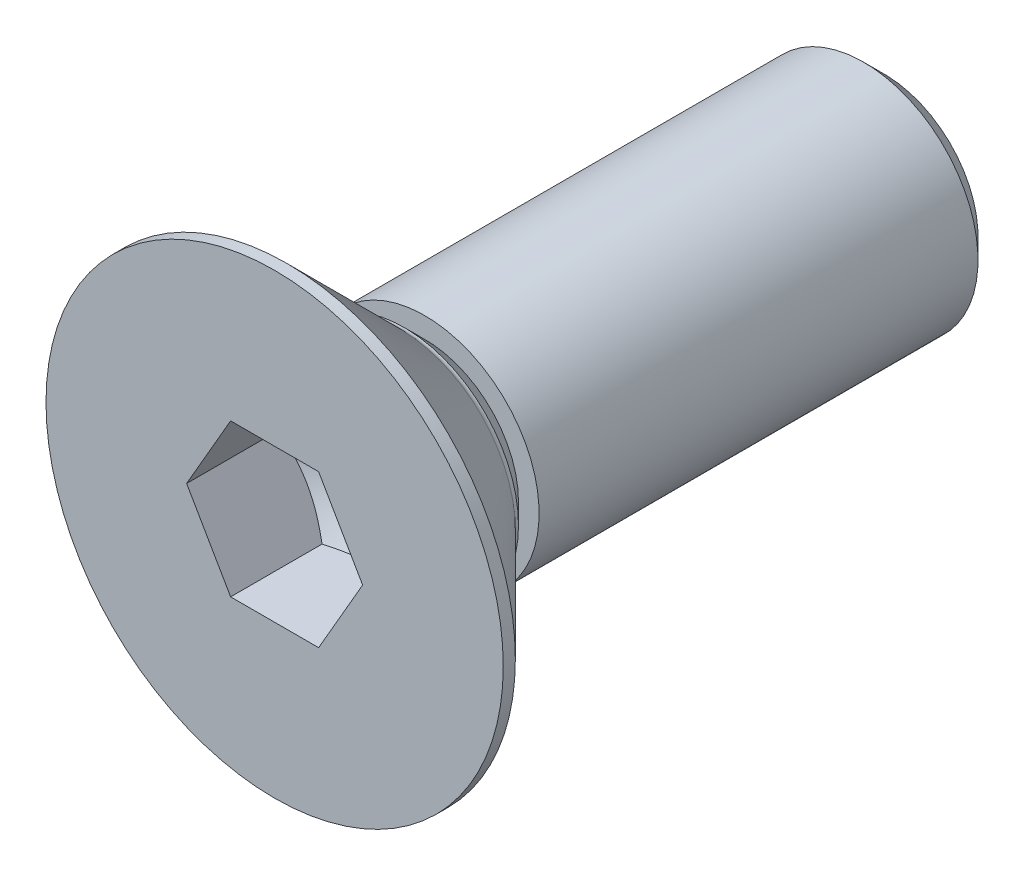
ISO-10303-21;
HEADER;
FILE_DESCRIPTION(('STEP AP214'),'2;1');
FILE_NAME('part.step','',(''),(''),'','','');
FILE_SCHEMA(('AUTOMOTIVE_DESIGN { 1 0 10303 214 1 1 1 1 }'));
ENDSEC;
DATA;
#1=APPLICATION_CONTEXT('core data for automotive mechanical design processes');
#2=APPLICATION_PROTOCOL_DEFINITION('international standard','automotive_design',2000,#1);
#3=PRODUCT_CONTEXT('',#1,'mechanical');
#4=PRODUCT('Part','Part','',(#3));
#5=PRODUCT_RELATED_PRODUCT_CATEGORY('part','',(#4));
#6=PRODUCT_DEFINITION_FORMATION('','',#4);
#7=PRODUCT_DEFINITION_CONTEXT('part definition',#1,'design');
#8=PRODUCT_DEFINITION('design','',#6,#7);
#9=PRODUCT_DEFINITION_SHAPE('','',#8);
#10=(LENGTH_UNIT() NAMED_UNIT(*) SI_UNIT(.MILLI.,.METRE.));
#11=(NAMED_UNIT(*) PLANE_ANGLE_UNIT() SI_UNIT($,.RADIAN.));
#12=(NAMED_UNIT(*) SI_UNIT($,.STERADIAN.) SOLID_ANGLE_UNIT());
#13=UNCERTAINTY_MEASURE_WITH_UNIT(LENGTH_MEASURE(1.E-05),#10,'distance_accuracy_value','');
#14=(GEOMETRIC_REPRESENTATION_CONTEXT(3) GLOBAL_UNCERTAINTY_ASSIGNED_CONTEXT((#13)) GLOBAL_UNIT_ASSIGNED_CONTEXT((#10,
#11,#12)) REPRESENTATION_CONTEXT('',''));
#15=CARTESIAN_POINT('',(0.,0.,0.));
#16=DIRECTION('',(0.,0.,1.));
#17=DIRECTION('',(1.,0.,0.));
#18=AXIS2_PLACEMENT_3D('',#15,#16,#17);
#19=CARTESIAN_POINT('',(0.,3.,0.));
#20=DIRECTION('',(0.,0.,-1.));
#21=DIRECTION('',(-1.,0.,0.));
#22=AXIS2_PLACEMENT_3D('',#19,#20,#21);
#23=PLANE('',#22);
#24=CARTESIAN_POINT('',(0.,0.,0.));
#25=DIRECTION('',(0.,0.,1.));
#26=DIRECTION('',(1.,0.,0.));
#27=AXIS2_PLACEMENT_3D('',#24,#25,#26);
#28=CIRCLE('',#27,3.);
#29=CARTESIAN_POINT('',(3.,0.,0.));
#30=VERTEX_POINT('',#29);
#31=EDGE_CURVE('E161',#30,#30,#28,.T.);
#32=ORIENTED_EDGE('',*,*,#31,.T.);
#33=EDGE_LOOP('',(#32));
#34=FACE_BOUND('',#33,.T.);
#35=DIRECTION('',(-0.5,0.866025403784438,0.));
#36=VECTOR('',#35,1.);
#37=CARTESIAN_POINT('',(-0.43301310567666,2.74999976687495,0.));
#38=LINE('',#37,#36);
#39=CARTESIAN_POINT('',(1.1547,0.,0.));
#40=VERTEX_POINT('',#39);
#41=CARTESIAN_POINT('',(0.57735,0.999999533749892,0.));
#42=VERTEX_POINT('',#41);
#43=EDGE_CURVE('E122',#40,#42,#38,.T.);
#44=ORIENTED_EDGE('',*,*,#43,.F.);
#45=DIRECTION('',(0.5,0.866025403784439,0.));
#46=VECTOR('',#45,1.);
#47=CARTESIAN_POINT('',(2.16506310567666,1.75000023312505,0.));
#48=LINE('',#47,#46);
#49=CARTESIAN_POINT('',(0.57735,-0.999999533749891,0.));
#50=VERTEX_POINT('',#49);
#51=EDGE_CURVE('E69',#50,#40,#48,.T.);
#52=ORIENTED_EDGE('',*,*,#51,.F.);
#53=DIRECTION('',(1.,0.,0.));
#54=VECTOR('',#53,1.);
#55=CARTESIAN_POINT('',(0.,-0.999999533749891,0.));
#56=LINE('',#55,#54);
#57=CARTESIAN_POINT('',(-0.57735,-0.999999533749892,0.));
#58=VERTEX_POINT('',#57);
#59=EDGE_CURVE('E247',#58,#50,#56,.T.);
#60=ORIENTED_EDGE('',*,*,#59,.F.);
#61=DIRECTION('',(0.5,-0.866025403784439,0.));
#62=VECTOR('',#61,1.);
#63=CARTESIAN_POINT('',(-2.16506310567666,1.75000023312505,0.));
#64=LINE('',#63,#62);
#65=CARTESIAN_POINT('',(-1.1547,0.,0.));
#66=VERTEX_POINT('',#65);
#67=EDGE_CURVE('E252',#66,#58,#64,.T.);
#68=ORIENTED_EDGE('',*,*,#67,.F.);
#69=DIRECTION('',(-0.5,-0.866025403784439,0.));
#70=VECTOR('',#69,1.);
#71=CARTESIAN_POINT('',(0.433013105676658,2.74999976687495,0.));
#72=LINE('',#71,#70);
#73=CARTESIAN_POINT('',(-0.57735,0.999999533749891,0.));
#74=VERTEX_POINT('',#73);
#75=EDGE_CURVE('E255',#74,#66,#72,.T.);
#76=ORIENTED_EDGE('',*,*,#75,.F.);
#77=DIRECTION('',(-1.,0.,0.));
#78=VECTOR('',#77,1.);
#79=CARTESIAN_POINT('',(0.,0.999999533749892,0.));
#80=LINE('',#79,#78);
#81=EDGE_CURVE('E239',#42,#74,#80,.T.);
#82=ORIENTED_EDGE('',*,*,#81,.F.);
#83=EDGE_LOOP('',(#44,#52,#60,#68,#76,#82));
#84=FACE_BOUND('',#83,.T.);
#85=ADVANCED_FACE('F46',(#34,#84),#23,.F.);
#86=CARTESIAN_POINT('',(0.,0.,-1.7));
#87=DIRECTION('',(0.,0.,1.));
#88=DIRECTION('',(1.,0.,0.));
#89=AXIS2_PLACEMENT_3D('',#86,#87,#88);
#90=TOROIDAL_SURFACE('',#89,1.6,0.1);
#91=CARTESIAN_POINT('',(0.,0.,-1.7));
#92=DIRECTION('',(0.,0.,1.));
#93=DIRECTION('',(1.,0.,0.));
#94=AXIS2_PLACEMENT_3D('',#91,#92,#93);
#95=CIRCLE('',#94,1.5);
#96=CARTESIAN_POINT('',(1.5,0.,-1.7));
#97=VERTEX_POINT('',#96);
#98=EDGE_CURVE('E187',#97,#97,#95,.T.);
#99=ORIENTED_EDGE('',*,*,#98,.T.);
#100=EDGE_LOOP('',(#99));
#101=FACE_BOUND('',#100,.T.);
#102=CARTESIAN_POINT('',(0.,0.,-1.62928932188134));
#103=DIRECTION('',(0.,0.,1.));
#104=DIRECTION('',(1.,0.,0.));
#105=AXIS2_PLACEMENT_3D('',#102,#103,#104);
#106=CIRCLE('',#105,1.52928932188135);
#107=CARTESIAN_POINT('',(1.52928932188135,0.,-1.62928932188134));
#108=VERTEX_POINT('',#107);
#109=EDGE_CURVE('E260',#108,#108,#106,.T.);
#110=ORIENTED_EDGE('',*,*,#109,.F.);
#111=EDGE_LOOP('',(#110));
#112=FACE_BOUND('',#111,.T.);
#113=ADVANCED_FACE('F225',(#101,#112),#90,.F.);
#114=CARTESIAN_POINT('',(0.,0.,-1.62928932188134));
#115=DIRECTION('',(0.,0.,1.));
#116=DIRECTION('',(1.,0.,0.));
#117=AXIS2_PLACEMENT_3D('',#114,#115,#116);
#118=CONICAL_SURFACE('',#117,1.52928932188135,0.785398163397448);
#119=CARTESIAN_POINT('',(0.,0.,-0.15857864376269));
#120=DIRECTION('',(0.,0.,1.));
#121=DIRECTION('',(1.,0.,0.));
#122=AXIS2_PLACEMENT_3D('',#119,#120,#121);
#123=CIRCLE('',#122,3.);
#124=CARTESIAN_POINT('',(3.,0.,-0.15857864376269));
#125=VERTEX_POINT('',#124);
#126=EDGE_CURVE('E264',#125,#125,#123,.T.);
#127=ORIENTED_EDGE('',*,*,#126,.F.);
#128=EDGE_LOOP('',(#127));
#129=FACE_BOUND('',#128,.T.);
#130=ORIENTED_EDGE('',*,*,#109,.T.);
#131=EDGE_LOOP('',(#130));
#132=FACE_BOUND('',#131,.T.);
#133=ADVANCED_FACE('F221',(#129,#132),#118,.T.);
#134=CARTESIAN_POINT('',(0.,0.,0.));
#135=DIRECTION('',(0.,0.,1.));
#136=DIRECTION('',(1.,0.,0.));
#137=AXIS2_PLACEMENT_3D('',#134,#135,#136);
#138=CYLINDRICAL_SURFACE('',#137,3.);
#139=ORIENTED_EDGE('',*,*,#31,.F.);
#140=EDGE_LOOP('',(#139));
#141=FACE_BOUND('',#140,.T.);
#142=ORIENTED_EDGE('',*,*,#126,.T.);
#143=EDGE_LOOP('',(#142));
#144=FACE_BOUND('',#143,.T.);
#145=ADVANCED_FACE('F218',(#141,#144),#138,.T.);
#146=CARTESIAN_POINT('',(0.57735,0.999999533749892,-2.86666635583326));
#147=DIRECTION('',(-0.866025403784438,-0.5,0.));
#148=DIRECTION('',(-0.5,0.866025403784438,0.));
#149=AXIS2_PLACEMENT_3D('',#146,#147,#148);
#150=PLANE('',#149);
#151=ORIENTED_EDGE('',*,*,#43,.T.);
#152=DIRECTION('',(0.,0.,1.));
#153=VECTOR('',#152,1.);
#154=CARTESIAN_POINT('',(0.57735,0.999999533749892,-2.86666635583326));
#155=LINE('',#154,#153);
#156=CARTESIAN_POINT('',(0.57735,0.999999533749892,-1.2));
#157=VERTEX_POINT('',#156);
#158=EDGE_CURVE('E61',#157,#42,#155,.T.);
#159=ORIENTED_EDGE('',*,*,#158,.F.);
#160=CARTESIAN_POINT('',(1.15470115470054,-1.9999999999573E-06,-1.19999933333233));
#161=CARTESIAN_POINT('',(1.12933009927234,0.0439419570432813,-1.21465160869452));
#162=CARTESIAN_POINT('',(1.10374004129754,0.0882652376242722,-1.22797709465646));
#163=CARTESIAN_POINT('',(1.05211684902319,0.17767922949234,-1.25123634937556));
#164=CARTESIAN_POINT('',(1.02608279776624,0.22277152899623,-1.26116189075497));
#165=CARTESIAN_POINT('',(0.974337322784001,0.312397320727257,-1.27661173775717));
#166=CARTESIAN_POINT('',(0.948633858612371,0.356917026603046,-1.28223888221856));
#167=CARTESIAN_POINT('',(0.897106047785879,0.446165812957328,-1.28895530751385));
#168=CARTESIAN_POINT('',(0.871281888296732,0.490894569255293,-1.29005015141485));
#169=CARTESIAN_POINT('',(0.823032064442526,0.574465715627026,-1.28776689498848));
#170=CARTESIAN_POINT('',(0.800599160429648,0.613320645138646,-1.2849494098561));
#171=CARTESIAN_POINT('',(0.755879495715112,0.690777376521668,-1.27602137620272));
#172=CARTESIAN_POINT('',(0.733592889575674,0.729378910683451,-1.26990778075883));
#173=CARTESIAN_POINT('',(0.688781095362013,0.806995215039832,-1.25462494978085));
#174=CARTESIAN_POINT('',(0.666261576071427,0.846000166613155,-1.2453909604397));
#175=CARTESIAN_POINT('',(0.621558322302024,0.923428473405406,-1.2244336985923));
#176=CARTESIAN_POINT('',(0.599374015548132,0.961852819833839,-1.21271534716617));
#177=CARTESIAN_POINT('',(0.577348845299461,1.00000153374989,-1.19999933333233));
#178=B_SPLINE_CURVE_WITH_KNOTS('',3,(#160,#161,#162,#163,#164,#165,#166,#167,#168,#169,#170,
#171,#172,#173,#174,#175,#176,#177),.UNSPECIFIED.,.F.,.F.,(4,2,2,2,2,2,2,2,4),(0.,
0.158508089994533,0.317397081098293,0.47235404642363,0.627120756921707,0.76185516297255,
0.896714331530991,1.0345640617321,1.17214324556804),.UNSPECIFIED.);
#179=CARTESIAN_POINT('',(1.1547,0.,-1.2));
#180=VERTEX_POINT('',#179);
#181=EDGE_CURVE('E111',#180,#157,#178,.T.);
#182=ORIENTED_EDGE('',*,*,#181,.F.);
#183=DIRECTION('',(0.,0.,1.));
#184=VECTOR('',#183,1.);
#185=CARTESIAN_POINT('',(1.1547,0.,-2.86666635583326));
#186=LINE('',#185,#184);
#187=EDGE_CURVE('E151',#180,#40,#186,.T.);
#188=ORIENTED_EDGE('',*,*,#187,.T.);
#189=EDGE_LOOP('',(#151,#159,#182,#188));
#190=FACE_BOUND('',#189,.T.);
#191=ADVANCED_FACE('F120',(#190),#150,.T.);
#192=CARTESIAN_POINT('',(1.1547,0.,-2.86666635583326));
#193=DIRECTION('',(-0.866025403784439,0.5,0.));
#194=DIRECTION('',(0.5,0.866025403784439,0.));
#195=AXIS2_PLACEMENT_3D('',#192,#193,#194);
#196=PLANE('',#195);
#197=ORIENTED_EDGE('',*,*,#51,.T.);
#198=ORIENTED_EDGE('',*,*,#187,.F.);
#199=CARTESIAN_POINT('',(0.577348845299462,-1.00000153374989,-1.19999933333233));
#200=CARTESIAN_POINT('',(0.602719900727658,-0.956057576706609,-1.21465160869452));
#201=CARTESIAN_POINT('',(0.628309958702461,-0.911734296125618,-1.22797709465646));
#202=CARTESIAN_POINT('',(0.679933150976809,-0.82232030425755,-1.25123634937556));
#203=CARTESIAN_POINT('',(0.705967202233759,-0.77722800475366,-1.26116189075497));
#204=CARTESIAN_POINT('',(0.757712677216,-0.687602213022634,-1.27661173775717));
#205=CARTESIAN_POINT('',(0.78341614138763,-0.643082507146845,-1.28223888221856));
#206=CARTESIAN_POINT('',(0.834943952214122,-0.553833720792562,-1.28895530751385));
#207=CARTESIAN_POINT('',(0.860768111703269,-0.509104964494598,-1.29005015141485));
#208=CARTESIAN_POINT('',(0.909017935557475,-0.425533818122865,-1.28776689498848));
#209=CARTESIAN_POINT('',(0.931450839570352,-0.386678888611245,-1.2849494098561));
#210=CARTESIAN_POINT('',(0.976170504284888,-0.309222157228223,-1.27602137620272));
#211=CARTESIAN_POINT('',(0.998457110424327,-0.27062062306644,-1.26990778075883));
#212=CARTESIAN_POINT('',(1.04326890463799,-0.193004318710059,-1.25462494978085));
#213=CARTESIAN_POINT('',(1.06578842392857,-0.153999367136736,-1.2453909604397));
#214=CARTESIAN_POINT('',(1.11049167769798,-0.0765710603444854,-1.2244336985923));
#215=CARTESIAN_POINT('',(1.13267598445187,-0.0381467139160524,-1.21271534716617));
#216=CARTESIAN_POINT('',(1.15470115470054,1.99999999991757E-06,-1.19999933333233));
#217=B_SPLINE_CURVE_WITH_KNOTS('',3,(#199,#200,#201,#202,#203,#204,#205,#206,#207,#208,#209,
#210,#211,#212,#213,#214,#215,#216),.UNSPECIFIED.,.F.,.F.,(4,2,2,2,2,2,2,2,4),(0.,
0.158508089994532,0.317397081098292,0.472354046423629,0.627120756921705,0.761855162972549,
0.89671433153099,1.0345640617321,1.17214324556804),.UNSPECIFIED.);
#218=CARTESIAN_POINT('',(0.57735,-0.999999533749891,-1.2));
#219=VERTEX_POINT('',#218);
#220=EDGE_CURVE('E116',#219,#180,#217,.T.);
#221=ORIENTED_EDGE('',*,*,#220,.F.);
#222=DIRECTION('',(0.,0.,1.));
#223=VECTOR('',#222,1.);
#224=CARTESIAN_POINT('',(0.57735,-0.999999533749891,-2.86666635583326));
#225=LINE('',#224,#223);
#226=EDGE_CURVE('E148',#219,#50,#225,.T.);
#227=ORIENTED_EDGE('',*,*,#226,.T.);
#228=EDGE_LOOP('',(#197,#198,#221,#227));
#229=FACE_BOUND('',#228,.T.);
#230=ADVANCED_FACE('F211',(#229),#196,.T.);
#231=CARTESIAN_POINT('',(0.57735,-0.999999533749891,-2.86666635583326));
#232=DIRECTION('',(0.,1.,0.));
#233=DIRECTION('',(1.,0.,0.));
#234=AXIS2_PLACEMENT_3D('',#231,#232,#233);
#235=PLANE('',#234);
#236=ORIENTED_EDGE('',*,*,#59,.T.);
#237=ORIENTED_EDGE('',*,*,#226,.F.);
#238=CARTESIAN_POINT('',(-1.49514442485991,-0.999999533749892,-0.828164884370704));
#239=CARTESIAN_POINT('',(-1.45196058536606,-0.999999533749892,-0.848885142345374));
#240=CARTESIAN_POINT('',(-1.40867216909359,-0.999999533749891,-0.869386480926814));
#241=CARTESIAN_POINT('',(-1.32182886600433,-0.999999533749891,-0.909836700302959));
#242=CARTESIAN_POINT('',(-1.2782739329316,-0.999999533749891,-0.929785481674132));
#243=CARTESIAN_POINT('',(-1.14662287013031,-0.999999533749891,-0.988854941047534));
#244=CARTESIAN_POINT('',(-1.05805675536899,-0.999999533749892,-1.02694755109633));
#245=CARTESIAN_POINT('',(-0.876832601569534,-0.999999533749891,-1.0997542233085));
#246=CARTESIAN_POINT('',(-0.784128092285833,-0.999999533749891,-1.13435418810903));
#247=CARTESIAN_POINT('',(-0.596331471486308,-0.999999533749891,-1.19592652723152));
#248=CARTESIAN_POINT('',(-0.501246273385447,-0.999999533749892,-1.2229187041279));
#249=CARTESIAN_POINT('',(-0.356699820153757,-0.999999533749892,-1.25422420468152));
#250=CARTESIAN_POINT('',(-0.308244019411516,-0.999999533749891,-1.26312487202941));
#251=CARTESIAN_POINT('',(-0.210788772252077,-0.999999533749891,-1.27725753224299));
#252=CARTESIAN_POINT('',(-0.161789362800288,-0.999999533749891,-1.28248977302728));
#253=CARTESIAN_POINT('',(-0.0641060187969571,-0.999999533749891,-1.28880097762652));
#254=CARTESIAN_POINT('',(-0.0154253386130911,-0.999999533749891,-1.28992895306237));
#255=CARTESIAN_POINT('',(0.081855318550815,-0.999999533749891,-1.28806698061856));
#256=CARTESIAN_POINT('',(0.130455290347174,-0.999999533749891,-1.28507677775785));
#257=CARTESIAN_POINT('',(0.250369475163949,-0.999999533749891,-1.27288164404504));
#258=CARTESIAN_POINT('',(0.321451773511317,-0.999999533749891,-1.26139140968933));
#259=CARTESIAN_POINT('',(0.462228831139483,-0.999999533749891,-1.23175966587677));
#260=CARTESIAN_POINT('',(0.531921810918688,-0.999999533749891,-1.2136101400332));
#261=CARTESIAN_POINT('',(0.671415426701006,-0.999999533749891,-1.17213028702696));
#262=CARTESIAN_POINT('',(0.74118339183766,-0.999999533749891,-1.14869285275451));
#263=CARTESIAN_POINT('',(0.879437913589634,-0.999999533749891,-1.09843555752384));
#264=CARTESIAN_POINT('',(0.947924910374636,-0.999999533749891,-1.07161688390175));
#265=CARTESIAN_POINT('',(1.12214344819038,-0.999999533749891,-0.999946665973691));
#266=CARTESIAN_POINT('',(1.22718281828392,-0.999999533749891,-0.953428848532586));
#267=CARTESIAN_POINT('',(1.43575436261154,-0.999999533749891,-0.857125429903967));
#268=CARTESIAN_POINT('',(1.53928614185372,-0.999999533749891,-0.80733899050407));
#269=CARTESIAN_POINT('',(1.74545816034081,-0.999999533749891,-0.705667813198291));
#270=CARTESIAN_POINT('',(1.84809723800399,-0.999999533749891,-0.653780729163059));
#271=CARTESIAN_POINT('',(2.05268820074271,-0.999999533749891,-0.548667861023064));
#272=CARTESIAN_POINT('',(2.15464006298767,-0.999999533749891,-0.495442032717929));
#273=CARTESIAN_POINT('',(2.34844987211842,-0.999999533749891,-0.393141194911444));
#274=CARTESIAN_POINT('',(2.4403516275912,-0.999999533749891,-0.344149002309723));
#275=CARTESIAN_POINT('',(2.62385949655876,-0.999999533749891,-0.245606629023408));
#276=CARTESIAN_POINT('',(2.71546559895035,-0.999999533749891,-0.196056427689531));
#277=CARTESIAN_POINT('',(2.89821733508573,-0.999999533749891,-0.0966643053291436));
#278=CARTESIAN_POINT('',(2.98936354739568,-0.99999953374989,-0.0468234468561076));
#279=CARTESIAN_POINT('',(3.17147169543988,-0.99999953374989,0.0531826635437778));
#280=CARTESIAN_POINT('',(3.26243364056806,-0.999999533749891,0.103347898358038));
#281=CARTESIAN_POINT('',(3.35332938008973,-0.999999533749891,0.153632054375236));
#282=B_SPLINE_CURVE_WITH_KNOTS('',3,(#238,#239,#240,#241,#242,#243,#244,#245,#246,#247,#248,
#249,#250,#251,#252,#253,#254,#255,#256,#257,#258,#259,#260,#261,#262,#263,#264,#265,#266,#267,
#268,#269,#270,#271,#272,#273,#274,#275,#276,#277,#278,#279,#280,#281),.UNSPECIFIED.,.F.,.F.,(4,
2,2,2,2,2,2,2,2,2,2,2,2,2,2,2,2,2,2,2,2,4),(0.,0.143690272658494,0.287406234227527,
0.576560055393514,0.873259077741899,1.16917852539457,1.31686277501978,1.46453704292645,
1.6104419422712,1.75635587586723,1.9719244208457,2.1877533209983,2.40842488718949,
2.62901917835835,2.97354524236226,3.31816000509865,3.66317088870179,4.0081931782759,
4.32062550425272,4.63306943012528,4.94471865214482,5.25635156499875),.UNSPECIFIED.);
#283=CARTESIAN_POINT('',(-0.57735,-0.999999533749892,-1.2));
#284=VERTEX_POINT('',#283);
#285=EDGE_CURVE('E197',#284,#219,#282,.T.);
#286=ORIENTED_EDGE('',*,*,#285,.F.);
#287=DIRECTION('',(0.,0.,1.));
#288=VECTOR('',#287,1.);
#289=CARTESIAN_POINT('',(-0.57735,-0.999999533749892,-2.86666635583326));
#290=LINE('',#289,#288);
#291=EDGE_CURVE('E144',#284,#58,#290,.T.);
#292=ORIENTED_EDGE('',*,*,#291,.T.);
#293=EDGE_LOOP('',(#236,#237,#286,#292));
#294=FACE_BOUND('',#293,.T.);
#295=ADVANCED_FACE('F208',(#294),#235,.T.);
#296=CARTESIAN_POINT('',(-0.57735,-0.999999533749892,-2.86666635583326));
#297=DIRECTION('',(0.866025403784439,0.5,0.));
#298=DIRECTION('',(0.5,-0.866025403784439,0.));
#299=AXIS2_PLACEMENT_3D('',#296,#297,#298);
#300=PLANE('',#299);
#301=ORIENTED_EDGE('',*,*,#67,.T.);
#302=ORIENTED_EDGE('',*,*,#291,.F.);
#303=CARTESIAN_POINT('',(-1.15470115470054,1.99999999972245E-06,-1.19999933333233));
#304=CARTESIAN_POINT('',(-1.12933009927234,-0.0439419570432819,-1.21465160869452));
#305=CARTESIAN_POINT('',(-1.10374004129754,-0.088265237624273,-1.22797709465646));
#306=CARTESIAN_POINT('',(-1.05211684902319,-0.177679229492341,-1.25123634937556));
#307=CARTESIAN_POINT('',(-1.02608279776624,-0.222771528996231,-1.26116189075497));
#308=CARTESIAN_POINT('',(-0.974337322784,-0.312397320727257,-1.27661173775717));
#309=CARTESIAN_POINT('',(-0.948633858612371,-0.356917026603046,-1.28223888221856));
#310=CARTESIAN_POINT('',(-0.897106047785878,-0.446165812957329,-1.28895530751385));
#311=CARTESIAN_POINT('',(-0.871281888296731,-0.490894569255293,-1.29005015141485));
#312=CARTESIAN_POINT('',(-0.823032064442525,-0.574465715627026,-1.28776689498848));
#313=CARTESIAN_POINT('',(-0.800599160429648,-0.613320645138646,-1.2849494098561));
#314=CARTESIAN_POINT('',(-0.755879495715112,-0.690777376521668,-1.27602137620272));
#315=CARTESIAN_POINT('',(-0.733592889575674,-0.729378910683452,-1.26990778075883));
#316=CARTESIAN_POINT('',(-0.688781095362013,-0.806995215039832,-1.25462494978085));
#317=CARTESIAN_POINT('',(-0.666261576071427,-0.846000166613155,-1.2453909604397));
#318=CARTESIAN_POINT('',(-0.621558322302024,-0.923428473405406,-1.2244336985923));
#319=CARTESIAN_POINT('',(-0.599374015548133,-0.961852819833839,-1.21271534716617));
#320=CARTESIAN_POINT('',(-0.577348845299461,-1.00000153374989,-1.19999933333233));
#321=B_SPLINE_CURVE_WITH_KNOTS('',3,(#303,#304,#305,#306,#307,#308,#309,#310,#311,#312,#313,
#314,#315,#316,#317,#318,#319,#320),.UNSPECIFIED.,.F.,.F.,(4,2,2,2,2,2,2,2,4),(0.,
0.158508089994533,0.317397081098293,0.472354046423629,0.627120756921706,0.76185516297255,
0.89671433153099,1.0345640617321,1.17214324556804),.UNSPECIFIED.);
#322=CARTESIAN_POINT('',(-1.1547,0.,-1.2));
#323=VERTEX_POINT('',#322);
#324=EDGE_CURVE('E186',#323,#284,#321,.T.);
#325=ORIENTED_EDGE('',*,*,#324,.F.);
#326=DIRECTION('',(0.,0.,1.));
#327=VECTOR('',#326,1.);
#328=CARTESIAN_POINT('',(-1.1547,0.,-2.86666635583326));
#329=LINE('',#328,#327);
#330=EDGE_CURVE('E131',#323,#66,#329,.T.);
#331=ORIENTED_EDGE('',*,*,#330,.T.);
#332=EDGE_LOOP('',(#301,#302,#325,#331));
#333=FACE_BOUND('',#332,.T.);
#334=ADVANCED_FACE('F173',(#333),#300,.T.);
#335=CARTESIAN_POINT('',(-1.1547,0.,-2.86666635583326));
#336=DIRECTION('',(0.866025403784439,-0.5,0.));
#337=DIRECTION('',(-0.5,-0.866025403784439,0.));
#338=AXIS2_PLACEMENT_3D('',#335,#336,#337);
#339=PLANE('',#338);
#340=ORIENTED_EDGE('',*,*,#75,.T.);
#341=ORIENTED_EDGE('',*,*,#330,.F.);
#342=CARTESIAN_POINT('',(-0.577348845299462,1.00000153374989,-1.19999933333233));
#343=CARTESIAN_POINT('',(-0.602719900727658,0.956057576706609,-1.21465160869452));
#344=CARTESIAN_POINT('',(-0.628309958702461,0.911734296125618,-1.22797709465646));
#345=CARTESIAN_POINT('',(-0.679933150976809,0.82232030425755,-1.25123634937556));
#346=CARTESIAN_POINT('',(-0.705967202233759,0.77722800475366,-1.26116189075497));
#347=CARTESIAN_POINT('',(-0.757712677216,0.687602213022634,-1.27661173775717));
#348=CARTESIAN_POINT('',(-0.78341614138763,0.643082507146845,-1.28223888221856));
#349=CARTESIAN_POINT('',(-0.834943952214122,0.553833720792562,-1.28895530751385));
#350=CARTESIAN_POINT('',(-0.860768111703269,0.509104964494598,-1.29005015141485));
#351=CARTESIAN_POINT('',(-0.909017935557475,0.425533818122865,-1.28776689498848));
#352=CARTESIAN_POINT('',(-0.931450839570352,0.386678888611245,-1.2849494098561));
#353=CARTESIAN_POINT('',(-0.976170504284889,0.309222157228223,-1.27602137620272));
#354=CARTESIAN_POINT('',(-0.998457110424327,0.27062062306644,-1.26990778075883));
#355=CARTESIAN_POINT('',(-1.04326890463799,0.193004318710059,-1.25462494978085));
#356=CARTESIAN_POINT('',(-1.06578842392857,0.153999367136736,-1.2453909604397));
#357=CARTESIAN_POINT('',(-1.11049167769798,0.0765710603444851,-1.2244336985923));
#358=CARTESIAN_POINT('',(-1.13267598445187,0.0381467139160521,-1.21271534716617));
#359=CARTESIAN_POINT('',(-1.15470115470054,-2.00000000035485E-06,-1.19999933333233));
#360=B_SPLINE_CURVE_WITH_KNOTS('',3,(#342,#343,#344,#345,#346,#347,#348,#349,#350,#351,#352,
#353,#354,#355,#356,#357,#358,#359),.UNSPECIFIED.,.F.,.F.,(4,2,2,2,2,2,2,2,4),(0.,
0.158508089994533,0.317397081098292,0.472354046423628,0.627120756921705,0.761855162972549,
0.89671433153099,1.0345640617321,1.17214324556804),.UNSPECIFIED.);
#361=CARTESIAN_POINT('',(-0.57735,0.999999533749891,-1.2));
#362=VERTEX_POINT('',#361);
#363=EDGE_CURVE('E178',#362,#323,#360,.T.);
#364=ORIENTED_EDGE('',*,*,#363,.F.);
#365=DIRECTION('',(0.,0.,1.));
#366=VECTOR('',#365,1.);
#367=CARTESIAN_POINT('',(-0.57735,0.999999533749891,-2.86666635583326));
#368=LINE('',#367,#366);
#369=EDGE_CURVE('E125',#362,#74,#368,.T.);
#370=ORIENTED_EDGE('',*,*,#369,.T.);
#371=EDGE_LOOP('',(#340,#341,#364,#370));
#372=FACE_BOUND('',#371,.T.);
#373=ADVANCED_FACE('F169',(#372),#339,.T.);
#374=CARTESIAN_POINT('',(-0.57735,0.999999533749891,-2.86666635583326));
#375=DIRECTION('',(0.,-1.,0.));
#376=DIRECTION('',(-1.,0.,0.));
#377=AXIS2_PLACEMENT_3D('',#374,#375,#376);
#378=PLANE('',#377);
#379=ORIENTED_EDGE('',*,*,#81,.T.);
#380=ORIENTED_EDGE('',*,*,#369,.F.);
#381=CARTESIAN_POINT('',(-1.49514442485992,0.999999533749891,-0.828164884370704));
#382=CARTESIAN_POINT('',(-1.45196058536606,0.999999533749891,-0.848885142345374));
#383=CARTESIAN_POINT('',(-1.40867216909359,0.999999533749891,-0.869386480926813));
#384=CARTESIAN_POINT('',(-1.32182886600434,0.999999533749891,-0.909836700302958));
#385=CARTESIAN_POINT('',(-1.2782739329316,0.999999533749891,-0.929785481674132));
#386=CARTESIAN_POINT('',(-1.14662287013032,0.999999533749891,-0.988854941047534));
#387=CARTESIAN_POINT('',(-1.05805675536899,0.999999533749891,-1.02694755109632));
#388=CARTESIAN_POINT('',(-0.876832601569536,0.999999533749891,-1.0997542233085));
#389=CARTESIAN_POINT('',(-0.784128092285834,0.999999533749891,-1.13435418810903));
#390=CARTESIAN_POINT('',(-0.596331471486309,0.999999533749891,-1.19592652723152));
#391=CARTESIAN_POINT('',(-0.501246273385448,0.999999533749891,-1.2229187041279));
#392=CARTESIAN_POINT('',(-0.356699820153758,0.999999533749891,-1.25422420468152));
#393=CARTESIAN_POINT('',(-0.308244019411517,0.999999533749891,-1.26312487202941));
#394=CARTESIAN_POINT('',(-0.210788772252078,0.999999533749891,-1.27725753224299));
#395=CARTESIAN_POINT('',(-0.161789362800289,0.999999533749891,-1.28248977302728));
#396=CARTESIAN_POINT('',(-0.0641060187969578,0.999999533749891,-1.28880097762652));
#397=CARTESIAN_POINT('',(-0.0154253386130918,0.999999533749891,-1.28992895306237));
#398=CARTESIAN_POINT('',(0.0818553185508143,0.999999533749891,-1.28806698061856));
#399=CARTESIAN_POINT('',(0.130455290347173,0.999999533749892,-1.28507677775785));
#400=CARTESIAN_POINT('',(0.250369475163948,0.999999533749892,-1.27288164404504));
#401=CARTESIAN_POINT('',(0.321451773511316,0.999999533749892,-1.26139140968933));
#402=CARTESIAN_POINT('',(0.462228831139481,0.999999533749891,-1.23175966587677));
#403=CARTESIAN_POINT('',(0.531921810918686,0.999999533749892,-1.2136101400332));
#404=CARTESIAN_POINT('',(0.671415426701004,0.999999533749892,-1.17213028702696));
#405=CARTESIAN_POINT('',(0.741183391837658,0.999999533749892,-1.14869285275451));
#406=CARTESIAN_POINT('',(0.879437913589632,0.999999533749892,-1.09843555752384));
#407=CARTESIAN_POINT('',(0.947924910374634,0.999999533749892,-1.07161688390175));
#408=CARTESIAN_POINT('',(1.12214344819038,0.999999533749892,-0.999946665973691));
#409=CARTESIAN_POINT('',(1.22718281828392,0.999999533749892,-0.953428848532586));
#410=CARTESIAN_POINT('',(1.43575436261153,0.999999533749892,-0.857125429903967));
#411=CARTESIAN_POINT('',(1.53928614185372,0.999999533749892,-0.80733899050407));
#412=CARTESIAN_POINT('',(1.74545816034081,0.999999533749892,-0.705667813198291));
#413=CARTESIAN_POINT('',(1.84809723800398,0.999999533749892,-0.65378072916306));
#414=CARTESIAN_POINT('',(2.05268820074271,0.999999533749892,-0.548667861023064));
#415=CARTESIAN_POINT('',(2.15464006298767,0.999999533749892,-0.495442032717929));
#416=CARTESIAN_POINT('',(2.34844987211841,0.999999533749892,-0.393141194911444));
#417=CARTESIAN_POINT('',(2.4403516275912,0.999999533749892,-0.344149002309723));
#418=CARTESIAN_POINT('',(2.62385949655876,0.999999533749892,-0.245606629023408));
#419=CARTESIAN_POINT('',(2.71546559895035,0.999999533749893,-0.196056427689531));
#420=CARTESIAN_POINT('',(2.89821733508573,0.999999533749893,-0.096664305329144));
#421=CARTESIAN_POINT('',(2.98936354739567,0.999999533749893,-0.0468234468561076));
#422=CARTESIAN_POINT('',(3.17147169543988,0.999999533749893,0.0531826635437783));
#423=CARTESIAN_POINT('',(3.26243364056806,0.999999533749893,0.103347898358039));
#424=CARTESIAN_POINT('',(3.35332938008973,0.999999533749893,0.153632054375236));
#425=B_SPLINE_CURVE_WITH_KNOTS('',3,(#381,#382,#383,#384,#385,#386,#387,#388,#389,#390,#391,
#392,#393,#394,#395,#396,#397,#398,#399,#400,#401,#402,#403,#404,#405,#406,#407,#408,#409,#410,
#411,#412,#413,#414,#415,#416,#417,#418,#419,#420,#421,#422,#423,#424),.UNSPECIFIED.,.F.,.F.,(4,
2,2,2,2,2,2,2,2,2,2,2,2,2,2,2,2,2,2,2,2,4),(0.,0.143690272658494,0.287406234227527,
0.576560055393514,0.873259077741899,1.16917852539457,1.31686277501978,1.46453704292645,
1.6104419422712,1.75635587586723,1.9719244208457,2.1877533209983,2.40842488718949,
2.62901917835835,2.97354524236226,3.31816000509865,3.66317088870179,4.0081931782759,
4.32062550425272,4.63306943012528,4.94471865214482,5.25635156499876),.UNSPECIFIED.);
#426=EDGE_CURVE('E113',#157,#362,#425,.F.);
#427=ORIENTED_EDGE('',*,*,#426,.F.);
#428=ORIENTED_EDGE('',*,*,#158,.T.);
#429=EDGE_LOOP('',(#379,#380,#427,#428));
#430=FACE_BOUND('',#429,.T.);
#431=ADVANCED_FACE('F106',(#430),#378,.T.);
#432=CARTESIAN_POINT('',(0.,0.,-1.86666635583326));
#433=DIRECTION('',(0.,0.,1.));
#434=DIRECTION('',(1.,0.,0.));
#435=AXIS2_PLACEMENT_3D('',#432,#433,#434);
#436=CONICAL_SURFACE('',#435,0.,1.0471975511966);
#437=CARTESIAN_POINT('',(0.,0.,-1.86666635583326));
#438=VERTEX_POINT('',#437);
#439=VERTEX_LOOP('',#438);
#440=FACE_BOUND('',#439,.T.);
#441=ORIENTED_EDGE('',*,*,#181,.T.);
#442=ORIENTED_EDGE('',*,*,#426,.T.);
#443=ORIENTED_EDGE('',*,*,#363,.T.);
#444=ORIENTED_EDGE('',*,*,#324,.T.);
#445=ORIENTED_EDGE('',*,*,#285,.T.);
#446=ORIENTED_EDGE('',*,*,#220,.T.);
#447=EDGE_LOOP('',(#441,#442,#443,#444,#445,#446));
#448=FACE_BOUND('',#447,.T.);
#449=ADVANCED_FACE('F102',(#440,#448),#436,.F.);
#450=CARTESIAN_POINT('',(0.,0.,-1.7));
#451=DIRECTION('',(0.,0.,1.));
#452=DIRECTION('',(1.,0.,0.));
#453=AXIS2_PLACEMENT_3D('',#450,#451,#452);
#454=CONICAL_SURFACE('',#453,1.5,0.785398163397448);
#455=CARTESIAN_POINT('',(0.,0.,-1.970625));
#456=DIRECTION('',(0.,0.,1.));
#457=DIRECTION('',(1.,0.,0.));
#458=AXIS2_PLACEMENT_3D('',#455,#456,#457);
#459=CIRCLE('',#458,1.229375);
#460=CARTESIAN_POINT('',(1.229375,0.,-1.970625));
#461=VERTEX_POINT('',#460);
#462=EDGE_CURVE('E414',#461,#461,#459,.F.);
#463=ORIENTED_EDGE('',*,*,#462,.F.);
#464=EDGE_LOOP('',(#463));
#465=FACE_BOUND('',#464,.T.);
#466=ORIENTED_EDGE('',*,*,#98,.F.);
#467=EDGE_LOOP('',(#466));
#468=FACE_BOUND('',#467,.T.);
#469=ADVANCED_FACE('F105',(#465,#468),#454,.T.);
#470=CARTESIAN_POINT('',(0.,0.,-8.));
#471=DIRECTION('',(0.,0.,1.));
#472=DIRECTION('',(1.,0.,0.));
#473=AXIS2_PLACEMENT_3D('',#470,#471,#472);
#474=CYLINDRICAL_SURFACE('',#473,1.5);
#475=CARTESIAN_POINT('',(0.,0.,-7.729375));
#476=DIRECTION('',(0.,0.,-1.));
#477=DIRECTION('',(-1.,0.,0.));
#478=AXIS2_PLACEMENT_3D('',#475,#476,#477);
#479=CIRCLE('',#478,1.5);
#480=CARTESIAN_POINT('',(-1.5,0.,-7.729375));
#481=VERTEX_POINT('',#480);
#482=EDGE_CURVE('E54',#481,#481,#479,.F.);
#483=ORIENTED_EDGE('',*,*,#482,.T.);
#484=EDGE_LOOP('',(#483));
#485=FACE_BOUND('',#484,.T.);
#486=CARTESIAN_POINT('',(0.,0.,-1.970625));
#487=DIRECTION('',(0.,0.,1.));
#488=DIRECTION('',(-1.,0.,0.));
#489=AXIS2_PLACEMENT_3D('',#486,#487,#488);
#490=CIRCLE('',#489,1.5);
#491=CARTESIAN_POINT('',(-1.5,0.,-1.970625));
#492=VERTEX_POINT('',#491);
#493=EDGE_CURVE('E527',#492,#492,#490,.T.);
#494=ORIENTED_EDGE('',*,*,#493,.F.);
#495=EDGE_LOOP('',(#494));
#496=FACE_BOUND('',#495,.T.);
#497=ADVANCED_FACE('F476',(#485,#496),#474,.T.);
#498=CARTESIAN_POINT('',(0.,0.,-8.));
#499=DIRECTION('',(0.,0.,-1.));
#500=DIRECTION('',(-1.,0.,0.));
#501=AXIS2_PLACEMENT_3D('',#498,#499,#500);
#502=PLANE('',#501);
#503=CARTESIAN_POINT('',(0.,0.,-8.));
#504=DIRECTION('',(0.,0.,-1.));
#505=DIRECTION('',(-1.,0.,0.));
#506=AXIS2_PLACEMENT_3D('',#503,#504,#505);
#507=CIRCLE('',#506,1.229375);
#508=CARTESIAN_POINT('',(-1.229375,0.,-8.));
#509=VERTEX_POINT('',#508);
#510=EDGE_CURVE('E12',#509,#509,#507,.T.);
#511=ORIENTED_EDGE('',*,*,#510,.T.);
#512=EDGE_LOOP('',(#511));
#513=FACE_BOUND('',#512,.T.);
#514=ADVANCED_FACE('F492',(#513),#502,.T.);
#515=CARTESIAN_POINT('',(0.,0.,-1.970625));
#516=DIRECTION('',(0.,0.,-1.));
#517=DIRECTION('',(-1.,0.,0.));
#518=AXIS2_PLACEMENT_3D('',#515,#516,#517);
#519=PLANE('',#518);
#520=ORIENTED_EDGE('',*,*,#462,.T.);
#521=EDGE_LOOP('',(#520));
#522=FACE_BOUND('',#521,.T.);
#523=ORIENTED_EDGE('',*,*,#493,.T.);
#524=EDGE_LOOP('',(#523));
#525=FACE_BOUND('',#524,.T.);
#526=ADVANCED_FACE('F487',(#522,#525),#519,.F.);
#527=CARTESIAN_POINT('',(0.,0.,-7.729375));
#528=DIRECTION('',(0.,0.,1.));
#529=DIRECTION('',(1.,0.,0.));
#530=AXIS2_PLACEMENT_3D('',#527,#528,#529);
#531=CONICAL_SURFACE('',#530,1.5,0.785398163397453);
#532=ORIENTED_EDGE('',*,*,#510,.F.);
#533=EDGE_LOOP('',(#532));
#534=FACE_BOUND('',#533,.T.);
#535=ORIENTED_EDGE('',*,*,#482,.F.);
#536=EDGE_LOOP('',(#535));
#537=FACE_BOUND('',#536,.T.);
#538=ADVANCED_FACE('F48',(#534,#537),#531,.T.);
#539=CLOSED_SHELL('',(#85,#113,#133,#145,#191,#230,#295,#334,#373,#431,#449,#469,#497,#514,#526,#538));
#540=MANIFOLD_SOLID_BREP('B2',#539);
#541=ADVANCED_BREP_SHAPE_REPRESENTATION('',(#18,#540),#14);
#542=SHAPE_DEFINITION_REPRESENTATION(#9,#541);
ENDSEC;
END-ISO-10303-21;
